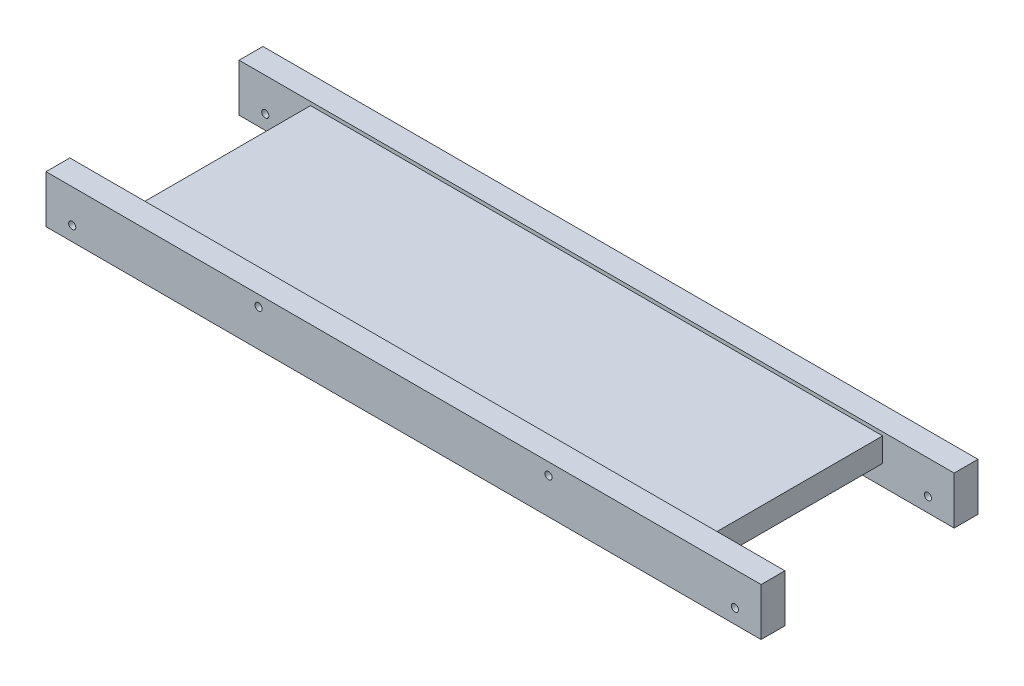
ISO-10303-21;
HEADER;
FILE_DESCRIPTION(('STEP AP214'),'2;1');
FILE_NAME('part.step','',(''),(''),'','','');
FILE_SCHEMA(('AUTOMOTIVE_DESIGN { 1 0 10303 214 1 1 1 1 }'));
ENDSEC;
DATA;
#1=APPLICATION_CONTEXT('core data for automotive mechanical design processes');
#2=APPLICATION_PROTOCOL_DEFINITION('international standard','automotive_design',2000,#1);
#3=PRODUCT_CONTEXT('',#1,'mechanical');
#4=PRODUCT('Part','Part','',(#3));
#5=PRODUCT_RELATED_PRODUCT_CATEGORY('part','',(#4));
#6=PRODUCT_DEFINITION_FORMATION('','',#4);
#7=PRODUCT_DEFINITION_CONTEXT('part definition',#1,'design');
#8=PRODUCT_DEFINITION('design','',#6,#7);
#9=PRODUCT_DEFINITION_SHAPE('','',#8);
#10=(LENGTH_UNIT() NAMED_UNIT(*) SI_UNIT(.MILLI.,.METRE.));
#11=(NAMED_UNIT(*) PLANE_ANGLE_UNIT() SI_UNIT($,.RADIAN.));
#12=(NAMED_UNIT(*) SI_UNIT($,.STERADIAN.) SOLID_ANGLE_UNIT());
#13=UNCERTAINTY_MEASURE_WITH_UNIT(LENGTH_MEASURE(1.E-05),#10,'distance_accuracy_value','');
#14=(GEOMETRIC_REPRESENTATION_CONTEXT(3) GLOBAL_UNCERTAINTY_ASSIGNED_CONTEXT((#13)) GLOBAL_UNIT_ASSIGNED_CONTEXT((#10,
#11,#12)) REPRESENTATION_CONTEXT('',''));
#15=CARTESIAN_POINT('',(0.,0.,0.));
#16=DIRECTION('',(0.,0.,1.));
#17=DIRECTION('',(1.,0.,0.));
#18=AXIS2_PLACEMENT_3D('',#15,#16,#17);
#19=CARTESIAN_POINT('',(0.,0.,0.));
#20=DIRECTION('',(0.,0.,-1.));
#21=DIRECTION('',(-1.,0.,0.));
#22=AXIS2_PLACEMENT_3D('',#19,#20,#21);
#23=PLANE('',#22);
#24=DIRECTION('',(0.,-1.,0.));
#25=VECTOR('',#24,1.);
#26=CARTESIAN_POINT('',(-150.,9.99999999999998,0.));
#27=LINE('',#26,#25);
#28=CARTESIAN_POINT('',(-150.,9.99999999999998,0.));
#29=VERTEX_POINT('',#28);
#30=CARTESIAN_POINT('',(-150.,-10.,0.));
#31=VERTEX_POINT('',#30);
#32=EDGE_CURVE('E224',#29,#31,#27,.T.);
#33=ORIENTED_EDGE('',*,*,#32,.T.);
#34=DIRECTION('',(1.,0.,0.));
#35=VECTOR('',#34,1.);
#36=CARTESIAN_POINT('',(150.,-9.99999999999998,0.));
#37=LINE('',#36,#35);
#38=CARTESIAN_POINT('',(150.,-9.99999999999998,0.));
#39=VERTEX_POINT('',#38);
#40=EDGE_CURVE('E242',#31,#39,#37,.T.);
#41=ORIENTED_EDGE('',*,*,#40,.T.);
#42=DIRECTION('',(0.,1.,0.));
#43=VECTOR('',#42,1.);
#44=CARTESIAN_POINT('',(150.,10.,0.));
#45=LINE('',#44,#43);
#46=CARTESIAN_POINT('',(150.,10.,0.));
#47=VERTEX_POINT('',#46);
#48=EDGE_CURVE('E245',#39,#47,#45,.T.);
#49=ORIENTED_EDGE('',*,*,#48,.T.);
#50=DIRECTION('',(-1.,0.,0.));
#51=VECTOR('',#50,1.);
#52=CARTESIAN_POINT('',(150.,10.,0.));
#53=LINE('',#52,#51);
#54=EDGE_CURVE('E231',#47,#29,#53,.T.);
#55=ORIENTED_EDGE('',*,*,#54,.T.);
#56=EDGE_LOOP('',(#33,#41,#49,#55));
#57=FACE_BOUND('',#56,.T.);
#58=CARTESIAN_POINT('',(-139.,-4.00000000000002,0.));
#59=DIRECTION('',(0.,0.,1.));
#60=DIRECTION('',(1.,0.,0.));
#61=AXIS2_PLACEMENT_3D('',#58,#59,#60);
#62=CIRCLE('',#61,1.5);
#63=CARTESIAN_POINT('',(-137.5,-4.00000000000002,0.));
#64=VERTEX_POINT('',#63);
#65=EDGE_CURVE('E218',#64,#64,#62,.T.);
#66=ORIENTED_EDGE('',*,*,#65,.F.);
#67=EDGE_LOOP('',(#66));
#68=FACE_BOUND('',#67,.T.);
#69=CARTESIAN_POINT('',(139.,-4.00000000000002,0.));
#70=DIRECTION('',(0.,0.,1.));
#71=DIRECTION('',(-1.,0.,0.));
#72=AXIS2_PLACEMENT_3D('',#69,#70,#71);
#73=CIRCLE('',#72,1.5);
#74=CARTESIAN_POINT('',(137.5,-4.00000000000002,0.));
#75=VERTEX_POINT('',#74);
#76=EDGE_CURVE('E214',#75,#75,#73,.T.);
#77=ORIENTED_EDGE('',*,*,#76,.F.);
#78=EDGE_LOOP('',(#77));
#79=FACE_BOUND('',#78,.T.);
#80=DIRECTION('',(0.,-1.,0.));
#81=VECTOR('',#80,1.);
#82=CARTESIAN_POINT('',(-120.,8.49999999999999,0.));
#83=LINE('',#82,#81);
#84=CARTESIAN_POINT('',(-120.,8.49999999999999,0.));
#85=VERTEX_POINT('',#84);
#86=CARTESIAN_POINT('',(-120.,-1.50000000000002,0.));
#87=VERTEX_POINT('',#86);
#88=EDGE_CURVE('E141',#85,#87,#83,.T.);
#89=ORIENTED_EDGE('',*,*,#88,.F.);
#90=DIRECTION('',(-1.,0.,0.));
#91=VECTOR('',#90,1.);
#92=CARTESIAN_POINT('',(-120.,8.49999999999999,0.));
#93=LINE('',#92,#91);
#94=CARTESIAN_POINT('',(120.,8.49999999999999,0.));
#95=VERTEX_POINT('',#94);
#96=EDGE_CURVE('E188',#95,#85,#93,.T.);
#97=ORIENTED_EDGE('',*,*,#96,.F.);
#98=DIRECTION('',(0.,1.,0.));
#99=VECTOR('',#98,1.);
#100=CARTESIAN_POINT('',(120.,8.49999999999999,0.));
#101=LINE('',#100,#99);
#102=CARTESIAN_POINT('',(120.,-1.50000000000002,0.));
#103=VERTEX_POINT('',#102);
#104=EDGE_CURVE('E65',#103,#95,#101,.T.);
#105=ORIENTED_EDGE('',*,*,#104,.F.);
#106=DIRECTION('',(1.,0.,0.));
#107=VECTOR('',#106,1.);
#108=CARTESIAN_POINT('',(-120.,-1.50000000000002,0.));
#109=LINE('',#108,#107);
#110=EDGE_CURVE('E60',#87,#103,#109,.T.);
#111=ORIENTED_EDGE('',*,*,#110,.F.);
#112=EDGE_LOOP('',(#89,#97,#105,#111));
#113=FACE_BOUND('',#112,.T.);
#114=ADVANCED_FACE('F43',(#57,#68,#79,#113),#23,.F.);
#115=CARTESIAN_POINT('',(-150.,9.99999999999998,-10.));
#116=DIRECTION('',(-1.,0.,0.));
#117=DIRECTION('',(0.,0.,1.));
#118=AXIS2_PLACEMENT_3D('',#115,#116,#117);
#119=PLANE('',#118);
#120=ORIENTED_EDGE('',*,*,#32,.F.);
#121=DIRECTION('',(0.,0.,1.));
#122=VECTOR('',#121,1.);
#123=CARTESIAN_POINT('',(-150.,9.99999999999998,-10.));
#124=LINE('',#123,#122);
#125=CARTESIAN_POINT('',(-150.,9.99999999999998,-10.));
#126=VERTEX_POINT('',#125);
#127=EDGE_CURVE('E11',#126,#29,#124,.T.);
#128=ORIENTED_EDGE('',*,*,#127,.F.);
#129=DIRECTION('',(0.,-1.,0.));
#130=VECTOR('',#129,1.);
#131=CARTESIAN_POINT('',(-150.,9.99999999999998,-10.));
#132=LINE('',#131,#130);
#133=CARTESIAN_POINT('',(-150.,-10.,-10.));
#134=VERTEX_POINT('',#133);
#135=EDGE_CURVE('E227',#126,#134,#132,.T.);
#136=ORIENTED_EDGE('',*,*,#135,.T.);
#137=DIRECTION('',(0.,0.,1.));
#138=VECTOR('',#137,1.);
#139=CARTESIAN_POINT('',(-150.,-10.,-10.));
#140=LINE('',#139,#138);
#141=EDGE_CURVE('E47',#134,#31,#140,.T.);
#142=ORIENTED_EDGE('',*,*,#141,.T.);
#143=EDGE_LOOP('',(#120,#128,#136,#142));
#144=FACE_BOUND('',#143,.T.);
#145=ADVANCED_FACE('F45',(#144),#119,.T.);
#146=CARTESIAN_POINT('',(150.,10.,-10.));
#147=DIRECTION('',(0.,1.,0.));
#148=DIRECTION('',(-1.,0.,0.));
#149=AXIS2_PLACEMENT_3D('',#146,#147,#148);
#150=PLANE('',#149);
#151=ORIENTED_EDGE('',*,*,#54,.F.);
#152=DIRECTION('',(0.,0.,1.));
#153=VECTOR('',#152,1.);
#154=CARTESIAN_POINT('',(150.,10.,-10.));
#155=LINE('',#154,#153);
#156=CARTESIAN_POINT('',(150.,10.,-10.));
#157=VERTEX_POINT('',#156);
#158=EDGE_CURVE('E52',#157,#47,#155,.T.);
#159=ORIENTED_EDGE('',*,*,#158,.F.);
#160=DIRECTION('',(-1.,0.,0.));
#161=VECTOR('',#160,1.);
#162=CARTESIAN_POINT('',(150.,10.,-10.));
#163=LINE('',#162,#161);
#164=EDGE_CURVE('E237',#157,#126,#163,.T.);
#165=ORIENTED_EDGE('',*,*,#164,.T.);
#166=ORIENTED_EDGE('',*,*,#127,.T.);
#167=EDGE_LOOP('',(#151,#159,#165,#166));
#168=FACE_BOUND('',#167,.T.);
#169=ADVANCED_FACE('F263',(#168),#150,.T.);
#170=CARTESIAN_POINT('',(150.,10.,-10.));
#171=DIRECTION('',(1.,0.,0.));
#172=DIRECTION('',(0.,0.,-1.));
#173=AXIS2_PLACEMENT_3D('',#170,#171,#172);
#174=PLANE('',#173);
#175=ORIENTED_EDGE('',*,*,#48,.F.);
#176=DIRECTION('',(0.,0.,1.));
#177=VECTOR('',#176,1.);
#178=CARTESIAN_POINT('',(150.,-9.99999999999998,-10.));
#179=LINE('',#178,#177);
#180=CARTESIAN_POINT('',(150.,-9.99999999999998,-10.));
#181=VERTEX_POINT('',#180);
#182=EDGE_CURVE('E250',#181,#39,#179,.T.);
#183=ORIENTED_EDGE('',*,*,#182,.F.);
#184=DIRECTION('',(0.,1.,0.));
#185=VECTOR('',#184,1.);
#186=CARTESIAN_POINT('',(150.,10.,-10.));
#187=LINE('',#186,#185);
#188=EDGE_CURVE('E234',#181,#157,#187,.T.);
#189=ORIENTED_EDGE('',*,*,#188,.T.);
#190=ORIENTED_EDGE('',*,*,#158,.T.);
#191=EDGE_LOOP('',(#175,#183,#189,#190));
#192=FACE_BOUND('',#191,.T.);
#193=ADVANCED_FACE('F269',(#192),#174,.T.);
#194=CARTESIAN_POINT('',(150.,-9.99999999999998,-10.));
#195=DIRECTION('',(0.,-1.,0.));
#196=DIRECTION('',(1.,0.,0.));
#197=AXIS2_PLACEMENT_3D('',#194,#195,#196);
#198=PLANE('',#197);
#199=ORIENTED_EDGE('',*,*,#40,.F.);
#200=ORIENTED_EDGE('',*,*,#141,.F.);
#201=DIRECTION('',(1.,0.,0.));
#202=VECTOR('',#201,1.);
#203=CARTESIAN_POINT('',(150.,-9.99999999999998,-10.));
#204=LINE('',#203,#202);
#205=EDGE_CURVE('E230',#134,#181,#204,.T.);
#206=ORIENTED_EDGE('',*,*,#205,.T.);
#207=ORIENTED_EDGE('',*,*,#182,.T.);
#208=EDGE_LOOP('',(#199,#200,#206,#207));
#209=FACE_BOUND('',#208,.T.);
#210=ADVANCED_FACE('F258',(#209),#198,.T.);
#211=CARTESIAN_POINT('',(0.,0.,-10.));
#212=DIRECTION('',(0.,0.,-1.));
#213=DIRECTION('',(-1.,0.,0.));
#214=AXIS2_PLACEMENT_3D('',#211,#212,#213);
#215=PLANE('',#214);
#216=CARTESIAN_POINT('',(60.8276255,5.00000000000003,-10.));
#217=DIRECTION('',(0.,0.,-1.));
#218=DIRECTION('',(-1.,0.,0.));
#219=AXIS2_PLACEMENT_3D('',#216,#217,#218);
#220=CIRCLE('',#219,1.5);
#221=CARTESIAN_POINT('',(59.3276255,5.00000000000003,-10.));
#222=VERTEX_POINT('',#221);
#223=EDGE_CURVE('E352',#222,#222,#220,.T.);
#224=ORIENTED_EDGE('',*,*,#223,.F.);
#225=EDGE_LOOP('',(#224));
#226=FACE_BOUND('',#225,.T.);
#227=CARTESIAN_POINT('',(-60.8276251059644,5.47833584140076,-10.));
#228=DIRECTION('',(0.,0.,-1.));
#229=DIRECTION('',(-1.,0.,0.));
#230=AXIS2_PLACEMENT_3D('',#227,#228,#229);
#231=CIRCLE('',#230,1.50000000000003);
#232=CARTESIAN_POINT('',(-62.3276251059644,5.47833584140076,-10.));
#233=VERTEX_POINT('',#232);
#234=EDGE_CURVE('E353',#233,#233,#231,.T.);
#235=ORIENTED_EDGE('',*,*,#234,.F.);
#236=EDGE_LOOP('',(#235));
#237=FACE_BOUND('',#236,.T.);
#238=CARTESIAN_POINT('',(139.,-4.00000000000002,-10.));
#239=DIRECTION('',(0.,0.,1.));
#240=DIRECTION('',(-1.,0.,0.));
#241=AXIS2_PLACEMENT_3D('',#238,#239,#240);
#242=CIRCLE('',#241,1.5);
#243=CARTESIAN_POINT('',(137.5,-4.00000000000002,-10.));
#244=VERTEX_POINT('',#243);
#245=EDGE_CURVE('E215',#244,#244,#242,.T.);
#246=ORIENTED_EDGE('',*,*,#245,.T.);
#247=EDGE_LOOP('',(#246));
#248=FACE_BOUND('',#247,.T.);
#249=CARTESIAN_POINT('',(-139.,-4.00000000000002,-10.));
#250=DIRECTION('',(0.,0.,1.));
#251=DIRECTION('',(1.,0.,0.));
#252=AXIS2_PLACEMENT_3D('',#249,#250,#251);
#253=CIRCLE('',#252,1.5);
#254=CARTESIAN_POINT('',(-137.5,-4.00000000000002,-10.));
#255=VERTEX_POINT('',#254);
#256=EDGE_CURVE('E221',#255,#255,#253,.T.);
#257=ORIENTED_EDGE('',*,*,#256,.T.);
#258=EDGE_LOOP('',(#257));
#259=FACE_BOUND('',#258,.T.);
#260=ORIENTED_EDGE('',*,*,#135,.F.);
#261=ORIENTED_EDGE('',*,*,#164,.F.);
#262=ORIENTED_EDGE('',*,*,#188,.F.);
#263=ORIENTED_EDGE('',*,*,#205,.F.);
#264=EDGE_LOOP('',(#260,#261,#262,#263));
#265=FACE_BOUND('',#264,.T.);
#266=ADVANCED_FACE('F266',(#226,#237,#248,#259,#265),#215,.T.);
#267=CARTESIAN_POINT('',(-139.,-4.00000000000002,-10.));
#268=DIRECTION('',(0.,0.,1.));
#269=DIRECTION('',(1.,0.,0.));
#270=AXIS2_PLACEMENT_3D('',#267,#268,#269);
#271=CYLINDRICAL_SURFACE('',#270,1.5);
#272=ORIENTED_EDGE('',*,*,#256,.F.);
#273=EDGE_LOOP('',(#272));
#274=FACE_BOUND('',#273,.T.);
#275=ORIENTED_EDGE('',*,*,#65,.T.);
#276=EDGE_LOOP('',(#275));
#277=FACE_BOUND('',#276,.T.);
#278=ADVANCED_FACE('F286',(#274,#277),#271,.F.);
#279=CARTESIAN_POINT('',(139.,-4.00000000000002,-10.));
#280=DIRECTION('',(0.,0.,1.));
#281=DIRECTION('',(1.,0.,0.));
#282=AXIS2_PLACEMENT_3D('',#279,#280,#281);
#283=CYLINDRICAL_SURFACE('',#282,1.5);
#284=ORIENTED_EDGE('',*,*,#245,.F.);
#285=EDGE_LOOP('',(#284));
#286=FACE_BOUND('',#285,.T.);
#287=ORIENTED_EDGE('',*,*,#76,.T.);
#288=EDGE_LOOP('',(#287));
#289=FACE_BOUND('',#288,.T.);
#290=ADVANCED_FACE('F290',(#286,#289),#283,.F.);
#291=CARTESIAN_POINT('',(-120.,8.49999999999999,71.));
#292=DIRECTION('',(1.,0.,0.));
#293=DIRECTION('',(0.,0.,-1.));
#294=AXIS2_PLACEMENT_3D('',#291,#292,#293);
#295=PLANE('',#294);
#296=ORIENTED_EDGE('',*,*,#88,.T.);
#297=DIRECTION('',(0.,0.,-1.));
#298=VECTOR('',#297,1.);
#299=CARTESIAN_POINT('',(-120.,-1.50000000000002,71.));
#300=LINE('',#299,#298);
#301=CARTESIAN_POINT('',(-120.,-1.50000000000002,71.));
#302=VERTEX_POINT('',#301);
#303=EDGE_CURVE('E212',#302,#87,#300,.T.);
#304=ORIENTED_EDGE('',*,*,#303,.F.);
#305=DIRECTION('',(0.,-1.,0.));
#306=VECTOR('',#305,1.);
#307=CARTESIAN_POINT('',(-120.,8.49999999999999,71.));
#308=LINE('',#307,#306);
#309=CARTESIAN_POINT('',(-120.,8.49999999999999,71.));
#310=VERTEX_POINT('',#309);
#311=EDGE_CURVE('E184',#310,#302,#308,.T.);
#312=ORIENTED_EDGE('',*,*,#311,.F.);
#313=DIRECTION('',(0.,0.,-1.));
#314=VECTOR('',#313,1.);
#315=CARTESIAN_POINT('',(-120.,8.49999999999999,71.));
#316=LINE('',#315,#314);
#317=EDGE_CURVE('E197',#310,#85,#316,.T.);
#318=ORIENTED_EDGE('',*,*,#317,.T.);
#319=EDGE_LOOP('',(#296,#304,#312,#318));
#320=FACE_BOUND('',#319,.T.);
#321=ADVANCED_FACE('F294',(#320),#295,.F.);
#322=CARTESIAN_POINT('',(-120.,-1.50000000000002,71.));
#323=DIRECTION('',(0.,1.,0.));
#324=DIRECTION('',(0.,0.,1.));
#325=AXIS2_PLACEMENT_3D('',#322,#323,#324);
#326=PLANE('',#325);
#327=ORIENTED_EDGE('',*,*,#110,.T.);
#328=DIRECTION('',(0.,0.,-1.));
#329=VECTOR('',#328,1.);
#330=CARTESIAN_POINT('',(120.,-1.50000000000002,71.));
#331=LINE('',#330,#329);
#332=CARTESIAN_POINT('',(120.,-1.50000000000002,71.));
#333=VERTEX_POINT('',#332);
#334=EDGE_CURVE('E209',#333,#103,#331,.T.);
#335=ORIENTED_EDGE('',*,*,#334,.F.);
#336=DIRECTION('',(1.,0.,0.));
#337=VECTOR('',#336,1.);
#338=CARTESIAN_POINT('',(-120.,-1.50000000000002,71.));
#339=LINE('',#338,#337);
#340=EDGE_CURVE('E187',#302,#333,#339,.T.);
#341=ORIENTED_EDGE('',*,*,#340,.F.);
#342=ORIENTED_EDGE('',*,*,#303,.T.);
#343=EDGE_LOOP('',(#327,#335,#341,#342));
#344=FACE_BOUND('',#343,.T.);
#345=ADVANCED_FACE('F298',(#344),#326,.F.);
#346=CARTESIAN_POINT('',(120.,8.49999999999999,71.));
#347=DIRECTION('',(-1.,0.,0.));
#348=DIRECTION('',(0.,0.,1.));
#349=AXIS2_PLACEMENT_3D('',#346,#347,#348);
#350=PLANE('',#349);
#351=ORIENTED_EDGE('',*,*,#104,.T.);
#352=DIRECTION('',(0.,0.,-1.));
#353=VECTOR('',#352,1.);
#354=CARTESIAN_POINT('',(120.,8.49999999999999,71.));
#355=LINE('',#354,#353);
#356=CARTESIAN_POINT('',(120.,8.49999999999999,71.));
#357=VERTEX_POINT('',#356);
#358=EDGE_CURVE('E206',#357,#95,#355,.T.);
#359=ORIENTED_EDGE('',*,*,#358,.F.);
#360=DIRECTION('',(0.,1.,0.));
#361=VECTOR('',#360,1.);
#362=CARTESIAN_POINT('',(120.,8.49999999999999,71.));
#363=LINE('',#362,#361);
#364=EDGE_CURVE('E191',#333,#357,#363,.T.);
#365=ORIENTED_EDGE('',*,*,#364,.F.);
#366=ORIENTED_EDGE('',*,*,#334,.T.);
#367=EDGE_LOOP('',(#351,#359,#365,#366));
#368=FACE_BOUND('',#367,.T.);
#369=ADVANCED_FACE('F302',(#368),#350,.F.);
#370=CARTESIAN_POINT('',(-120.,8.49999999999999,71.));
#371=DIRECTION('',(0.,-1.,0.));
#372=DIRECTION('',(0.,0.,-1.));
#373=AXIS2_PLACEMENT_3D('',#370,#371,#372);
#374=PLANE('',#373);
#375=ORIENTED_EDGE('',*,*,#96,.T.);
#376=ORIENTED_EDGE('',*,*,#317,.F.);
#377=DIRECTION('',(-1.,0.,0.));
#378=VECTOR('',#377,1.);
#379=CARTESIAN_POINT('',(-120.,8.49999999999999,71.));
#380=LINE('',#379,#378);
#381=EDGE_CURVE('E194',#357,#310,#380,.T.);
#382=ORIENTED_EDGE('',*,*,#381,.F.);
#383=ORIENTED_EDGE('',*,*,#358,.T.);
#384=EDGE_LOOP('',(#375,#376,#382,#383));
#385=FACE_BOUND('',#384,.T.);
#386=ADVANCED_FACE('F306',(#385),#374,.F.);
#387=CARTESIAN_POINT('',(0.,0.,71.));
#388=DIRECTION('',(0.,0.,1.));
#389=DIRECTION('',(1.,0.,0.));
#390=AXIS2_PLACEMENT_3D('',#387,#388,#389);
#391=PLANE('',#390);
#392=CARTESIAN_POINT('',(139.,-4.00000000000002,71.));
#393=DIRECTION('',(0.,0.,1.));
#394=DIRECTION('',(1.,0.,0.));
#395=AXIS2_PLACEMENT_3D('',#392,#393,#394);
#396=CIRCLE('',#395,1.5);
#397=CARTESIAN_POINT('',(140.5,-4.00000000000002,71.));
#398=VERTEX_POINT('',#397);
#399=EDGE_CURVE('E162',#398,#398,#396,.T.);
#400=ORIENTED_EDGE('',*,*,#399,.T.);
#401=EDGE_LOOP('',(#400));
#402=FACE_BOUND('',#401,.T.);
#403=CARTESIAN_POINT('',(-139.,-4.00000000000002,71.));
#404=DIRECTION('',(0.,0.,1.));
#405=DIRECTION('',(1.,0.,0.));
#406=AXIS2_PLACEMENT_3D('',#403,#404,#405);
#407=CIRCLE('',#406,1.5);
#408=CARTESIAN_POINT('',(-137.5,-4.00000000000002,71.));
#409=VERTEX_POINT('',#408);
#410=EDGE_CURVE('E165',#409,#409,#407,.T.);
#411=ORIENTED_EDGE('',*,*,#410,.T.);
#412=EDGE_LOOP('',(#411));
#413=FACE_BOUND('',#412,.T.);
#414=DIRECTION('',(0.,-1.,0.));
#415=VECTOR('',#414,1.);
#416=CARTESIAN_POINT('',(150.,0.,71.));
#417=LINE('',#416,#415);
#418=CARTESIAN_POINT('',(150.,9.99999999999998,71.));
#419=VERTEX_POINT('',#418);
#420=CARTESIAN_POINT('',(150.,-9.99999999999998,71.));
#421=VERTEX_POINT('',#420);
#422=EDGE_CURVE('E136',#419,#421,#417,.T.);
#423=ORIENTED_EDGE('',*,*,#422,.T.);
#424=DIRECTION('',(1.,0.,0.));
#425=VECTOR('',#424,1.);
#426=CARTESIAN_POINT('',(0.,-9.99999999999998,71.));
#427=LINE('',#426,#425);
#428=CARTESIAN_POINT('',(-150.,-9.99999999999998,71.));
#429=VERTEX_POINT('',#428);
#430=EDGE_CURVE('E175',#429,#421,#427,.T.);
#431=ORIENTED_EDGE('',*,*,#430,.F.);
#432=DIRECTION('',(0.,-1.,0.));
#433=VECTOR('',#432,1.);
#434=CARTESIAN_POINT('',(-150.,0.,71.));
#435=LINE('',#434,#433);
#436=CARTESIAN_POINT('',(-150.,9.99999999999998,71.));
#437=VERTEX_POINT('',#436);
#438=EDGE_CURVE('E172',#437,#429,#435,.T.);
#439=ORIENTED_EDGE('',*,*,#438,.F.);
#440=DIRECTION('',(1.,0.,0.));
#441=VECTOR('',#440,1.);
#442=CARTESIAN_POINT('',(0.,9.99999999999998,71.));
#443=LINE('',#442,#441);
#444=EDGE_CURVE('E170',#437,#419,#443,.T.);
#445=ORIENTED_EDGE('',*,*,#444,.T.);
#446=EDGE_LOOP('',(#423,#431,#439,#445));
#447=FACE_BOUND('',#446,.T.);
#448=ORIENTED_EDGE('',*,*,#381,.T.);
#449=ORIENTED_EDGE('',*,*,#311,.T.);
#450=ORIENTED_EDGE('',*,*,#340,.T.);
#451=ORIENTED_EDGE('',*,*,#364,.T.);
#452=EDGE_LOOP('',(#448,#449,#450,#451));
#453=FACE_BOUND('',#452,.T.);
#454=ADVANCED_FACE('F310',(#402,#413,#447,#453),#391,.F.);
#455=CARTESIAN_POINT('',(150.,0.,81.));
#456=DIRECTION('',(1.,0.,0.));
#457=DIRECTION('',(0.,0.,-1.));
#458=AXIS2_PLACEMENT_3D('',#455,#456,#457);
#459=PLANE('',#458);
#460=ORIENTED_EDGE('',*,*,#422,.F.);
#461=DIRECTION('',(0.,0.,-1.));
#462=VECTOR('',#461,1.);
#463=CARTESIAN_POINT('',(150.,9.99999999999998,81.));
#464=LINE('',#463,#462);
#465=CARTESIAN_POINT('',(150.,9.99999999999998,81.));
#466=VERTEX_POINT('',#465);
#467=EDGE_CURVE('E131',#466,#419,#464,.T.);
#468=ORIENTED_EDGE('',*,*,#467,.F.);
#469=DIRECTION('',(0.,-1.,0.));
#470=VECTOR('',#469,1.);
#471=CARTESIAN_POINT('',(150.,0.,81.));
#472=LINE('',#471,#470);
#473=CARTESIAN_POINT('',(150.,-9.99999999999998,81.));
#474=VERTEX_POINT('',#473);
#475=EDGE_CURVE('E134',#466,#474,#472,.T.);
#476=ORIENTED_EDGE('',*,*,#475,.T.);
#477=DIRECTION('',(0.,0.,-1.));
#478=VECTOR('',#477,1.);
#479=CARTESIAN_POINT('',(150.,-9.99999999999998,81.));
#480=LINE('',#479,#478);
#481=EDGE_CURVE('E161',#474,#421,#480,.T.);
#482=ORIENTED_EDGE('',*,*,#481,.T.);
#483=EDGE_LOOP('',(#460,#468,#476,#482));
#484=FACE_BOUND('',#483,.T.);
#485=ADVANCED_FACE('F133',(#484),#459,.T.);
#486=CARTESIAN_POINT('',(0.,9.99999999999998,81.));
#487=DIRECTION('',(0.,1.,0.));
#488=DIRECTION('',(0.,0.,1.));
#489=AXIS2_PLACEMENT_3D('',#486,#487,#488);
#490=PLANE('',#489);
#491=ORIENTED_EDGE('',*,*,#444,.F.);
#492=DIRECTION('',(0.,0.,-1.));
#493=VECTOR('',#492,1.);
#494=CARTESIAN_POINT('',(-150.,9.99999999999998,81.));
#495=LINE('',#494,#493);
#496=CARTESIAN_POINT('',(-150.,9.99999999999998,81.));
#497=VERTEX_POINT('',#496);
#498=EDGE_CURVE('E142',#497,#437,#495,.T.);
#499=ORIENTED_EDGE('',*,*,#498,.F.);
#500=DIRECTION('',(1.,0.,0.));
#501=VECTOR('',#500,1.);
#502=CARTESIAN_POINT('',(0.,9.99999999999998,81.));
#503=LINE('',#502,#501);
#504=EDGE_CURVE('E148',#497,#466,#503,.T.);
#505=ORIENTED_EDGE('',*,*,#504,.T.);
#506=ORIENTED_EDGE('',*,*,#467,.T.);
#507=EDGE_LOOP('',(#491,#499,#505,#506));
#508=FACE_BOUND('',#507,.T.);
#509=ADVANCED_FACE('F153',(#508),#490,.T.);
#510=CARTESIAN_POINT('',(-150.,0.,81.));
#511=DIRECTION('',(1.,0.,0.));
#512=DIRECTION('',(0.,0.,-1.));
#513=AXIS2_PLACEMENT_3D('',#510,#511,#512);
#514=PLANE('',#513);
#515=ORIENTED_EDGE('',*,*,#438,.T.);
#516=DIRECTION('',(0.,0.,-1.));
#517=VECTOR('',#516,1.);
#518=CARTESIAN_POINT('',(-150.,-9.99999999999998,81.));
#519=LINE('',#518,#517);
#520=CARTESIAN_POINT('',(-150.,-9.99999999999998,81.));
#521=VERTEX_POINT('',#520);
#522=EDGE_CURVE('E180',#521,#429,#519,.T.);
#523=ORIENTED_EDGE('',*,*,#522,.F.);
#524=DIRECTION('',(0.,-1.,0.));
#525=VECTOR('',#524,1.);
#526=CARTESIAN_POINT('',(-150.,0.,81.));
#527=LINE('',#526,#525);
#528=EDGE_CURVE('E155',#497,#521,#527,.T.);
#529=ORIENTED_EDGE('',*,*,#528,.F.);
#530=ORIENTED_EDGE('',*,*,#498,.T.);
#531=EDGE_LOOP('',(#515,#523,#529,#530));
#532=FACE_BOUND('',#531,.T.);
#533=ADVANCED_FACE('F320',(#532),#514,.F.);
#534=CARTESIAN_POINT('',(-139.,-4.00000000000002,81.));
#535=DIRECTION('',(0.,0.,-1.));
#536=DIRECTION('',(-1.,0.,0.));
#537=AXIS2_PLACEMENT_3D('',#534,#535,#536);
#538=CYLINDRICAL_SURFACE('',#537,1.5);
#539=CARTESIAN_POINT('',(-139.,-4.00000000000002,81.));
#540=DIRECTION('',(0.,0.,1.));
#541=DIRECTION('',(1.,0.,0.));
#542=AXIS2_PLACEMENT_3D('',#539,#540,#541);
#543=CIRCLE('',#542,1.5);
#544=CARTESIAN_POINT('',(-137.5,-4.00000000000002,81.));
#545=VERTEX_POINT('',#544);
#546=EDGE_CURVE('E151',#545,#545,#543,.T.);
#547=ORIENTED_EDGE('',*,*,#546,.T.);
#548=EDGE_LOOP('',(#547));
#549=FACE_BOUND('',#548,.T.);
#550=ORIENTED_EDGE('',*,*,#410,.F.);
#551=EDGE_LOOP('',(#550));
#552=FACE_BOUND('',#551,.T.);
#553=ADVANCED_FACE('F316',(#549,#552),#538,.F.);
#554=CARTESIAN_POINT('',(139.,-4.00000000000002,81.));
#555=DIRECTION('',(0.,0.,-1.));
#556=DIRECTION('',(-1.,0.,0.));
#557=AXIS2_PLACEMENT_3D('',#554,#555,#556);
#558=CYLINDRICAL_SURFACE('',#557,1.5);
#559=CARTESIAN_POINT('',(139.,-4.00000000000002,81.));
#560=DIRECTION('',(0.,0.,1.));
#561=DIRECTION('',(1.,0.,0.));
#562=AXIS2_PLACEMENT_3D('',#559,#560,#561);
#563=CIRCLE('',#562,1.5);
#564=CARTESIAN_POINT('',(140.5,-4.00000000000002,81.));
#565=VERTEX_POINT('',#564);
#566=EDGE_CURVE('E178',#565,#565,#563,.T.);
#567=ORIENTED_EDGE('',*,*,#566,.T.);
#568=EDGE_LOOP('',(#567));
#569=FACE_BOUND('',#568,.T.);
#570=ORIENTED_EDGE('',*,*,#399,.F.);
#571=EDGE_LOOP('',(#570));
#572=FACE_BOUND('',#571,.T.);
#573=ADVANCED_FACE('F312',(#569,#572),#558,.F.);
#574=CARTESIAN_POINT('',(0.,-9.99999999999998,81.));
#575=DIRECTION('',(0.,1.,0.));
#576=DIRECTION('',(0.,0.,1.));
#577=AXIS2_PLACEMENT_3D('',#574,#575,#576);
#578=PLANE('',#577);
#579=ORIENTED_EDGE('',*,*,#430,.T.);
#580=ORIENTED_EDGE('',*,*,#481,.F.);
#581=DIRECTION('',(1.,0.,0.));
#582=VECTOR('',#581,1.);
#583=CARTESIAN_POINT('',(0.,-9.99999999999998,81.));
#584=LINE('',#583,#582);
#585=EDGE_CURVE('E149',#521,#474,#584,.T.);
#586=ORIENTED_EDGE('',*,*,#585,.F.);
#587=ORIENTED_EDGE('',*,*,#522,.T.);
#588=EDGE_LOOP('',(#579,#580,#586,#587));
#589=FACE_BOUND('',#588,.T.);
#590=ADVANCED_FACE('F315',(#589),#578,.F.);
#591=CARTESIAN_POINT('',(0.,0.,81.));
#592=DIRECTION('',(0.,0.,1.));
#593=DIRECTION('',(1.,0.,0.));
#594=AXIS2_PLACEMENT_3D('',#591,#592,#593);
#595=PLANE('',#594);
#596=CARTESIAN_POINT('',(60.8276255,5.00000000000003,81.));
#597=DIRECTION('',(0.,0.,-1.));
#598=DIRECTION('',(-1.,0.,0.));
#599=AXIS2_PLACEMENT_3D('',#596,#597,#598);
#600=CIRCLE('',#599,1.5);
#601=CARTESIAN_POINT('',(59.3276255,5.00000000000003,81.));
#602=VERTEX_POINT('',#601);
#603=EDGE_CURVE('E166',#602,#602,#600,.T.);
#604=ORIENTED_EDGE('',*,*,#603,.T.);
#605=EDGE_LOOP('',(#604));
#606=FACE_BOUND('',#605,.T.);
#607=CARTESIAN_POINT('',(-60.8276251059644,5.47833584140076,81.));
#608=DIRECTION('',(0.,0.,-1.));
#609=DIRECTION('',(-1.,0.,0.));
#610=AXIS2_PLACEMENT_3D('',#607,#608,#609);
#611=CIRCLE('',#610,1.50000000000003);
#612=CARTESIAN_POINT('',(-62.3276251059644,5.47833584140076,81.));
#613=VERTEX_POINT('',#612);
#614=EDGE_CURVE('E357',#613,#613,#611,.T.);
#615=ORIENTED_EDGE('',*,*,#614,.T.);
#616=EDGE_LOOP('',(#615));
#617=FACE_BOUND('',#616,.T.);
#618=ORIENTED_EDGE('',*,*,#566,.F.);
#619=EDGE_LOOP('',(#618));
#620=FACE_BOUND('',#619,.T.);
#621=ORIENTED_EDGE('',*,*,#546,.F.);
#622=EDGE_LOOP('',(#621));
#623=FACE_BOUND('',#622,.T.);
#624=ORIENTED_EDGE('',*,*,#475,.F.);
#625=ORIENTED_EDGE('',*,*,#504,.F.);
#626=ORIENTED_EDGE('',*,*,#528,.T.);
#627=ORIENTED_EDGE('',*,*,#585,.T.);
#628=EDGE_LOOP('',(#624,#625,#626,#627));
#629=FACE_BOUND('',#628,.T.);
#630=ADVANCED_FACE('F146',(#606,#617,#620,#623,#629),#595,.T.);
#631=CARTESIAN_POINT('',(-60.8276251059644,5.47833584140076,81.));
#632=DIRECTION('',(0.,0.,-1.));
#633=DIRECTION('',(-1.,0.,0.));
#634=AXIS2_PLACEMENT_3D('',#631,#632,#633);
#635=CYLINDRICAL_SURFACE('',#634,1.50000000000003);
#636=ORIENTED_EDGE('',*,*,#614,.F.);
#637=EDGE_LOOP('',(#636));
#638=FACE_BOUND('',#637,.T.);
#639=ORIENTED_EDGE('',*,*,#234,.T.);
#640=EDGE_LOOP('',(#639));
#641=FACE_BOUND('',#640,.T.);
#642=ADVANCED_FACE('F337',(#638,#641),#635,.F.);
#643=CARTESIAN_POINT('',(60.8276255,5.00000000000003,81.));
#644=DIRECTION('',(0.,0.,-1.));
#645=DIRECTION('',(-1.,0.,0.));
#646=AXIS2_PLACEMENT_3D('',#643,#644,#645);
#647=CYLINDRICAL_SURFACE('',#646,1.5);
#648=ORIENTED_EDGE('',*,*,#603,.F.);
#649=EDGE_LOOP('',(#648));
#650=FACE_BOUND('',#649,.T.);
#651=ORIENTED_EDGE('',*,*,#223,.T.);
#652=EDGE_LOOP('',(#651));
#653=FACE_BOUND('',#652,.T.);
#654=ADVANCED_FACE('F341',(#650,#653),#647,.F.);
#655=CLOSED_SHELL('',(#114,#145,#169,#193,#210,#266,#278,#290,#321,#345,#369,#386,#454,#485,
#509,#533,#553,#573,#590,#630,#642,#654));
#656=MANIFOLD_SOLID_BREP('B2',#655);
#657=ADVANCED_BREP_SHAPE_REPRESENTATION('',(#18,#656),#14);
#658=SHAPE_DEFINITION_REPRESENTATION(#9,#657);
ENDSEC;
END-ISO-10303-21;
